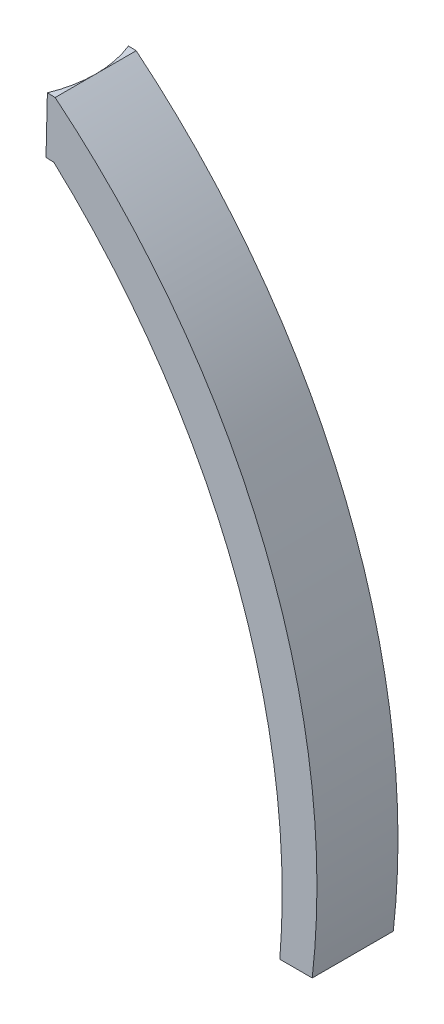
ISO-10303-21;
HEADER;
FILE_DESCRIPTION(('STEP AP214'),'2;1');
FILE_NAME('part.step','',(''),(''),'','','');
FILE_SCHEMA(('AUTOMOTIVE_DESIGN { 1 0 10303 214 1 1 1 1 }'));
ENDSEC;
DATA;
#1=APPLICATION_CONTEXT('core data for automotive mechanical design processes');
#2=APPLICATION_PROTOCOL_DEFINITION('international standard','automotive_design',2000,#1);
#3=PRODUCT_CONTEXT('',#1,'mechanical');
#4=PRODUCT('Part','Part','',(#3));
#5=PRODUCT_RELATED_PRODUCT_CATEGORY('part','',(#4));
#6=PRODUCT_DEFINITION_FORMATION('','',#4);
#7=PRODUCT_DEFINITION_CONTEXT('part definition',#1,'design');
#8=PRODUCT_DEFINITION('design','',#6,#7);
#9=PRODUCT_DEFINITION_SHAPE('','',#8);
#10=(LENGTH_UNIT() NAMED_UNIT(*) SI_UNIT(.MILLI.,.METRE.));
#11=(NAMED_UNIT(*) PLANE_ANGLE_UNIT() SI_UNIT($,.RADIAN.));
#12=(NAMED_UNIT(*) SI_UNIT($,.STERADIAN.) SOLID_ANGLE_UNIT());
#13=UNCERTAINTY_MEASURE_WITH_UNIT(LENGTH_MEASURE(1.E-05),#10,'distance_accuracy_value','');
#14=(GEOMETRIC_REPRESENTATION_CONTEXT(3) GLOBAL_UNCERTAINTY_ASSIGNED_CONTEXT((#13)) GLOBAL_UNIT_ASSIGNED_CONTEXT((#10,
#11,#12)) REPRESENTATION_CONTEXT('',''));
#15=CARTESIAN_POINT('',(0.,0.,0.));
#16=DIRECTION('',(0.,0.,1.));
#17=DIRECTION('',(1.,0.,0.));
#18=AXIS2_PLACEMENT_3D('',#15,#16,#17);
#19=CARTESIAN_POINT('',(-18.7574393025029,33.4181176490936,10.));
#20=DIRECTION('',(0.999712398671277,-0.0239816584689477,0.));
#21=DIRECTION('',(0.0239816584689477,0.999712398671277,0.));
#22=AXIS2_PLACEMENT_3D('',#19,#20,#21);
#23=PLANE('',#22);
#24=DIRECTION('',(0.,0.,1.));
#25=VECTOR('',#24,1.);
#26=CARTESIAN_POINT('',(-18.9253109117856,26.4201308583947,0.));
#27=LINE('',#26,#25);
#28=CARTESIAN_POINT('',(-18.9253109117855,26.4201308583947,0.));
#29=VERTEX_POINT('',#28);
#30=CARTESIAN_POINT('',(-18.9253109117856,26.4201308583947,5.));
#31=VERTEX_POINT('',#30);
#32=EDGE_CURVE('E70',#29,#31,#27,.T.);
#33=ORIENTED_EDGE('',*,*,#32,.F.);
#34=DIRECTION('',(-0.0239816584689477,-0.999712398671277,0.));
#35=VECTOR('',#34,1.);
#36=CARTESIAN_POINT('',(-18.7574393025029,33.4181176490936,0.));
#37=LINE('',#36,#35);
#38=CARTESIAN_POINT('',(-18.9253592057728,26.4181176490936,0.));
#39=VERTEX_POINT('',#38);
#40=EDGE_CURVE('E174',#29,#39,#37,.T.);
#41=ORIENTED_EDGE('',*,*,#40,.T.);
#42=DIRECTION('',(0.,0.,-1.));
#43=VECTOR('',#42,1.);
#44=CARTESIAN_POINT('',(-18.9253592057728,26.4181176490936,10.));
#45=LINE('',#44,#43);
#46=CARTESIAN_POINT('',(-18.9253592057728,26.4181176490936,10.));
#47=VERTEX_POINT('',#46);
#48=EDGE_CURVE('E63',#47,#39,#45,.T.);
#49=ORIENTED_EDGE('',*,*,#48,.F.);
#50=DIRECTION('',(-0.0239816584689477,-0.999712398671277,0.));
#51=VECTOR('',#50,1.);
#52=CARTESIAN_POINT('',(-18.7574393025029,33.4181176490936,10.));
#53=LINE('',#52,#51);
#54=CARTESIAN_POINT('',(-18.9253109117855,26.4201308583947,10.));
#55=VERTEX_POINT('',#54);
#56=EDGE_CURVE('E165',#55,#47,#53,.T.);
#57=ORIENTED_EDGE('',*,*,#56,.F.);
#58=DIRECTION('',(0.,0.,-1.));
#59=VECTOR('',#58,1.);
#60=CARTESIAN_POINT('',(-18.9253109117856,26.4201308583947,0.));
#61=LINE('',#60,#59);
#62=EDGE_CURVE('E77',#55,#31,#61,.T.);
#63=ORIENTED_EDGE('',*,*,#62,.T.);
#64=EDGE_LOOP('',(#33,#41,#49,#57,#63));
#65=FACE_BOUND('',#64,.T.);
#66=ADVANCED_FACE('F55',(#65),#23,.F.);
#67=CARTESIAN_POINT('',(-74.4528184170947,-34.7142883357378,10.));
#68=DIRECTION('',(0.,0.,-1.));
#69=DIRECTION('',(-1.,0.,0.));
#70=AXIS2_PLACEMENT_3D('',#67,#68,#69);
#71=CYLINDRICAL_SURFACE('',#70,88.);
#72=CARTESIAN_POINT('',(-74.4528184170947,-34.7142883357378,0.));
#73=DIRECTION('',(0.,0.,1.));
#74=DIRECTION('',(-1.,0.,0.));
#75=AXIS2_PLACEMENT_3D('',#72,#73,#74);
#76=CIRCLE('',#75,88.);
#77=CARTESIAN_POINT('',(12.9659358356675,-44.8118823509064,0.));
#78=VERTEX_POINT('',#77);
#79=CARTESIAN_POINT('',(-18.7574393025029,33.4181176490936,0.));
#80=VERTEX_POINT('',#79);
#81=EDGE_CURVE('E161',#78,#80,#76,.T.);
#82=ORIENTED_EDGE('',*,*,#81,.T.);
#83=DIRECTION('',(0.,0.,1.));
#84=VECTOR('',#83,1.);
#85=CARTESIAN_POINT('',(-18.7574393025029,33.4181176490936,0.));
#86=LINE('',#85,#84);
#87=CARTESIAN_POINT('',(-18.7574393025029,33.4181176490936,5.));
#88=VERTEX_POINT('',#87);
#89=EDGE_CURVE('E131',#80,#88,#86,.T.);
#90=ORIENTED_EDGE('',*,*,#89,.T.);
#91=DIRECTION('',(0.,0.,-1.));
#92=VECTOR('',#91,1.);
#93=CARTESIAN_POINT('',(-18.7574393025029,33.4181176490936,10.));
#94=LINE('',#93,#92);
#95=CARTESIAN_POINT('',(-18.7574393025029,33.4181176490936,10.));
#96=VERTEX_POINT('',#95);
#97=EDGE_CURVE('E12',#96,#88,#94,.T.);
#98=ORIENTED_EDGE('',*,*,#97,.F.);
#99=CARTESIAN_POINT('',(-74.4528184170947,-34.7142883357378,10.));
#100=DIRECTION('',(0.,0.,1.));
#101=DIRECTION('',(-1.,0.,0.));
#102=AXIS2_PLACEMENT_3D('',#99,#100,#101);
#103=CIRCLE('',#102,88.);
#104=CARTESIAN_POINT('',(12.9659358356675,-44.8118823509064,10.));
#105=VERTEX_POINT('',#104);
#106=EDGE_CURVE('E162',#105,#96,#103,.T.);
#107=ORIENTED_EDGE('',*,*,#106,.F.);
#108=DIRECTION('',(0.,0.,-1.));
#109=VECTOR('',#108,1.);
#110=CARTESIAN_POINT('',(12.9659358356675,-44.8118823509064,10.));
#111=LINE('',#110,#109);
#112=EDGE_CURVE('E172',#105,#78,#111,.T.);
#113=ORIENTED_EDGE('',*,*,#112,.T.);
#114=EDGE_LOOP('',(#82,#90,#98,#107,#113));
#115=FACE_BOUND('',#114,.T.);
#116=ADVANCED_FACE('F57',(#115),#71,.T.);
#117=CARTESIAN_POINT('',(-77.7419201121595,-37.6881391683599,10.));
#118=DIRECTION('',(0.,0.,-1.));
#119=DIRECTION('',(-1.,0.,0.));
#120=AXIS2_PLACEMENT_3D('',#117,#118,#119);
#121=CYLINDRICAL_SURFACE('',#120,87.);
#122=CARTESIAN_POINT('',(-77.7419201121595,-37.6881391683599,0.));
#123=DIRECTION('',(0.,0.,-1.));
#124=DIRECTION('',(-1.,0.,0.));
#125=AXIS2_PLACEMENT_3D('',#122,#123,#124);
#126=CIRCLE('',#125,87.);
#127=CARTESIAN_POINT('',(8.96593583566752,-44.8118823509064,0.));
#128=VERTEX_POINT('',#127);
#129=EDGE_CURVE('E176',#39,#128,#126,.T.);
#130=ORIENTED_EDGE('',*,*,#129,.T.);
#131=DIRECTION('',(0.,0.,-1.));
#132=VECTOR('',#131,1.);
#133=CARTESIAN_POINT('',(8.96593583566752,-44.8118823509064,10.));
#134=LINE('',#133,#132);
#135=CARTESIAN_POINT('',(8.96593583566752,-44.8118823509064,10.));
#136=VERTEX_POINT('',#135);
#137=EDGE_CURVE('E181',#136,#128,#134,.T.);
#138=ORIENTED_EDGE('',*,*,#137,.F.);
#139=CARTESIAN_POINT('',(-77.7419201121595,-37.6881391683599,10.));
#140=DIRECTION('',(0.,0.,-1.));
#141=DIRECTION('',(-1.,0.,0.));
#142=AXIS2_PLACEMENT_3D('',#139,#140,#141);
#143=CIRCLE('',#142,87.);
#144=EDGE_CURVE('E168',#47,#136,#143,.T.);
#145=ORIENTED_EDGE('',*,*,#144,.F.);
#146=ORIENTED_EDGE('',*,*,#48,.T.);
#147=EDGE_LOOP('',(#130,#138,#145,#146));
#148=FACE_BOUND('',#147,.T.);
#149=ADVANCED_FACE('F188',(#148),#121,.F.);
#150=CARTESIAN_POINT('',(8.96593583566752,-44.8118823509064,10.));
#151=DIRECTION('',(0.,1.,0.));
#152=DIRECTION('',(0.,0.,1.));
#153=AXIS2_PLACEMENT_3D('',#150,#151,#152);
#154=PLANE('',#153);
#155=DIRECTION('',(1.,0.,0.));
#156=VECTOR('',#155,1.);
#157=CARTESIAN_POINT('',(8.96593583566752,-44.8118823509064,0.));
#158=LINE('',#157,#156);
#159=EDGE_CURVE('E166',#128,#78,#158,.T.);
#160=ORIENTED_EDGE('',*,*,#159,.T.);
#161=ORIENTED_EDGE('',*,*,#112,.F.);
#162=DIRECTION('',(1.,0.,0.));
#163=VECTOR('',#162,1.);
#164=CARTESIAN_POINT('',(8.96593583566752,-44.8118823509064,10.));
#165=LINE('',#164,#163);
#166=EDGE_CURVE('E170',#136,#105,#165,.T.);
#167=ORIENTED_EDGE('',*,*,#166,.F.);
#168=ORIENTED_EDGE('',*,*,#137,.T.);
#169=EDGE_LOOP('',(#160,#161,#167,#168));
#170=FACE_BOUND('',#169,.T.);
#171=ADVANCED_FACE('F194',(#170),#154,.F.);
#172=CARTESIAN_POINT('',(-74.4528184170947,-34.7142883357378,10.));
#173=DIRECTION('',(0.,0.,-1.));
#174=DIRECTION('',(-1.,0.,0.));
#175=AXIS2_PLACEMENT_3D('',#172,#173,#174);
#176=PLANE('',#175);
#177=ORIENTED_EDGE('',*,*,#106,.T.);
#178=DIRECTION('',(-0.999712398671277,0.023981658468951,0.));
#179=VECTOR('',#178,1.);
#180=CARTESIAN_POINT('',(0.790403616716034,32.9491930930748,10.));
#181=LINE('',#180,#179);
#182=CARTESIAN_POINT('',(-19.7172269828951,33.4411415711581,10.));
#183=VERTEX_POINT('',#182);
#184=EDGE_CURVE('E145',#96,#183,#181,.T.);
#185=ORIENTED_EDGE('',*,*,#184,.T.);
#186=DIRECTION('',(0.0239816584689512,0.999712398671277,0.));
#187=VECTOR('',#186,1.);
#188=CARTESIAN_POINT('',(-19.8850985921777,26.4431547804591,10.));
#189=LINE('',#188,#187);
#190=CARTESIAN_POINT('',(-19.8850985921777,26.4431547804591,10.));
#191=VERTEX_POINT('',#190);
#192=EDGE_CURVE('E157',#191,#183,#189,.T.);
#193=ORIENTED_EDGE('',*,*,#192,.F.);
#194=DIRECTION('',(-0.999712398671277,0.023981658468951,0.));
#195=VECTOR('',#194,1.);
#196=CARTESIAN_POINT('',(0.622532007433375,25.9512063023759,10.));
#197=LINE('',#196,#195);
#198=EDGE_CURVE('E155',#55,#191,#197,.T.);
#199=ORIENTED_EDGE('',*,*,#198,.F.);
#200=ORIENTED_EDGE('',*,*,#56,.T.);
#201=ORIENTED_EDGE('',*,*,#144,.T.);
#202=ORIENTED_EDGE('',*,*,#166,.T.);
#203=EDGE_LOOP('',(#177,#185,#193,#199,#200,#201,#202));
#204=FACE_BOUND('',#203,.T.);
#205=ADVANCED_FACE('F200',(#204),#176,.F.);
#206=CARTESIAN_POINT('',(-74.4528184170947,-34.7142883357378,0.));
#207=DIRECTION('',(0.,0.,-1.));
#208=DIRECTION('',(-1.,0.,0.));
#209=AXIS2_PLACEMENT_3D('',#206,#207,#208);
#210=PLANE('',#209);
#211=ORIENTED_EDGE('',*,*,#81,.F.);
#212=ORIENTED_EDGE('',*,*,#159,.F.);
#213=ORIENTED_EDGE('',*,*,#129,.F.);
#214=ORIENTED_EDGE('',*,*,#40,.F.);
#215=DIRECTION('',(-0.999712398671277,0.023981658468951,0.));
#216=VECTOR('',#215,1.);
#217=CARTESIAN_POINT('',(0.622532007433375,25.9512063023759,0.));
#218=LINE('',#217,#216);
#219=CARTESIAN_POINT('',(-19.8850985921777,26.4431547804591,0.));
#220=VERTEX_POINT('',#219);
#221=EDGE_CURVE('E128',#29,#220,#218,.T.);
#222=ORIENTED_EDGE('',*,*,#221,.T.);
#223=DIRECTION('',(0.0239816584689512,0.999712398671277,0.));
#224=VECTOR('',#223,1.);
#225=CARTESIAN_POINT('',(-19.8850985921777,26.4431547804591,0.));
#226=LINE('',#225,#224);
#227=CARTESIAN_POINT('',(-19.7172269828951,33.4411415711581,0.));
#228=VERTEX_POINT('',#227);
#229=EDGE_CURVE('E121',#220,#228,#226,.T.);
#230=ORIENTED_EDGE('',*,*,#229,.T.);
#231=DIRECTION('',(-0.999712398671277,0.023981658468951,0.));
#232=VECTOR('',#231,1.);
#233=CARTESIAN_POINT('',(0.790403616716034,32.9491930930748,0.));
#234=LINE('',#233,#232);
#235=EDGE_CURVE('E126',#80,#228,#234,.T.);
#236=ORIENTED_EDGE('',*,*,#235,.F.);
#237=EDGE_LOOP('',(#211,#212,#213,#214,#222,#230,#236));
#238=FACE_BOUND('',#237,.T.);
#239=ADVANCED_FACE('F124',(#238),#210,.T.);
#240=CARTESIAN_POINT('',(-32.4214282938478,26.7438832477255,5.));
#241=DIRECTION('',(0.0239816584689512,0.999712398671277,0.));
#242=DIRECTION('',(-0.999712398671277,0.0239816584689512,0.));
#243=AXIS2_PLACEMENT_3D('',#240,#241,#242);
#244=CYLINDRICAL_SURFACE('',#243,13.5);
#245=CARTESIAN_POINT('',(-32.2535566845652,33.7418700384245,5.));
#246=DIRECTION('',(0.023981658468951,0.999712398671277,0.));
#247=DIRECTION('',(-0.999712398671277,0.023981658468951,0.));
#248=AXIS2_PLACEMENT_3D('',#245,#246,#247);
#249=CIRCLE('',#248,13.5);
#250=EDGE_CURVE('E139',#183,#88,#249,.T.);
#251=ORIENTED_EDGE('',*,*,#250,.T.);
#252=CARTESIAN_POINT('',(-32.2535566845652,33.7418700384245,5.));
#253=DIRECTION('',(0.023981658468951,0.999712398671277,0.));
#254=DIRECTION('',(-0.999712398671277,0.023981658468951,0.));
#255=AXIS2_PLACEMENT_3D('',#252,#253,#254);
#256=CIRCLE('',#255,13.5);
#257=EDGE_CURVE('E135',#88,#228,#256,.T.);
#258=ORIENTED_EDGE('',*,*,#257,.T.);
#259=ORIENTED_EDGE('',*,*,#229,.F.);
#260=CARTESIAN_POINT('',(-32.4214282938478,26.7438832477255,5.));
#261=DIRECTION('',(0.023981658468951,0.999712398671277,0.));
#262=DIRECTION('',(-0.999712398671277,0.023981658468951,0.));
#263=AXIS2_PLACEMENT_3D('',#260,#261,#262);
#264=CIRCLE('',#263,13.5);
#265=EDGE_CURVE('E147',#31,#220,#264,.T.);
#266=ORIENTED_EDGE('',*,*,#265,.F.);
#267=CARTESIAN_POINT('',(-32.4214282938478,26.7438832477255,5.));
#268=DIRECTION('',(0.023981658468951,0.999712398671277,0.));
#269=DIRECTION('',(-0.999712398671277,0.023981658468951,0.));
#270=AXIS2_PLACEMENT_3D('',#267,#268,#269);
#271=CIRCLE('',#270,13.5);
#272=EDGE_CURVE('E153',#191,#31,#271,.T.);
#273=ORIENTED_EDGE('',*,*,#272,.F.);
#274=ORIENTED_EDGE('',*,*,#192,.T.);
#275=EDGE_LOOP('',(#251,#258,#259,#266,#273,#274));
#276=FACE_BOUND('',#275,.T.);
#277=ADVANCED_FACE('F136',(#276),#244,.F.);
#278=CARTESIAN_POINT('',(0.622532007433375,25.9512063023759,0.));
#279=DIRECTION('',(0.023981658468951,0.999712398671277,0.));
#280=DIRECTION('',(-0.999712398671277,0.023981658468951,0.));
#281=AXIS2_PLACEMENT_3D('',#278,#279,#280);
#282=PLANE('',#281);
#283=ORIENTED_EDGE('',*,*,#272,.T.);
#284=ORIENTED_EDGE('',*,*,#62,.F.);
#285=ORIENTED_EDGE('',*,*,#198,.T.);
#286=EDGE_LOOP('',(#283,#284,#285));
#287=FACE_BOUND('',#286,.T.);
#288=ADVANCED_FACE('F205',(#287),#282,.F.);
#289=CARTESIAN_POINT('',(0.790403616716034,32.9491930930748,0.));
#290=DIRECTION('',(0.023981658468951,0.999712398671277,0.));
#291=DIRECTION('',(-0.999712398671277,0.023981658468951,0.));
#292=AXIS2_PLACEMENT_3D('',#289,#290,#291);
#293=PLANE('',#292);
#294=ORIENTED_EDGE('',*,*,#250,.F.);
#295=ORIENTED_EDGE('',*,*,#184,.F.);
#296=ORIENTED_EDGE('',*,*,#97,.T.);
#297=EDGE_LOOP('',(#294,#295,#296));
#298=FACE_BOUND('',#297,.T.);
#299=ADVANCED_FACE('F207',(#298),#293,.T.);
#300=CARTESIAN_POINT('',(0.622532007433375,25.9512063023759,0.));
#301=DIRECTION('',(0.023981658468951,0.999712398671277,0.));
#302=DIRECTION('',(-0.999712398671277,0.023981658468951,0.));
#303=AXIS2_PLACEMENT_3D('',#300,#301,#302);
#304=PLANE('',#303);
#305=ORIENTED_EDGE('',*,*,#265,.T.);
#306=ORIENTED_EDGE('',*,*,#221,.F.);
#307=ORIENTED_EDGE('',*,*,#32,.T.);
#308=EDGE_LOOP('',(#305,#306,#307));
#309=FACE_BOUND('',#308,.T.);
#310=ADVANCED_FACE('F203',(#309),#304,.F.);
#311=CARTESIAN_POINT('',(0.790403616716034,32.9491930930748,0.));
#312=DIRECTION('',(0.023981658468951,0.999712398671277,0.));
#313=DIRECTION('',(-0.999712398671277,0.023981658468951,0.));
#314=AXIS2_PLACEMENT_3D('',#311,#312,#313);
#315=PLANE('',#314);
#316=ORIENTED_EDGE('',*,*,#257,.F.);
#317=ORIENTED_EDGE('',*,*,#89,.F.);
#318=ORIENTED_EDGE('',*,*,#235,.T.);
#319=EDGE_LOOP('',(#316,#317,#318));
#320=FACE_BOUND('',#319,.T.);
#321=ADVANCED_FACE('F143',(#320),#315,.T.);
#322=CLOSED_SHELL('',(#66,#116,#149,#171,#205,#239,#277,#288,#299,#310,#321));
#323=MANIFOLD_SOLID_BREP('B2',#322);
#324=ADVANCED_BREP_SHAPE_REPRESENTATION('',(#18,#323),#14);
#325=SHAPE_DEFINITION_REPRESENTATION(#9,#324);
ENDSEC;
END-ISO-10303-21;
